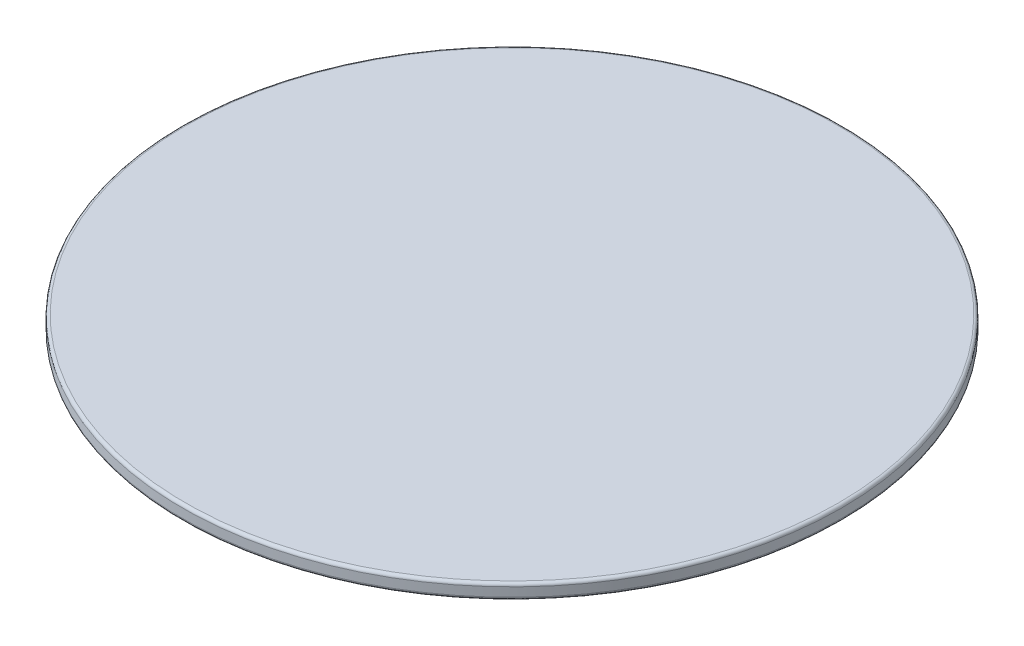
ISO-10303-21;
HEADER;
FILE_DESCRIPTION(('STEP AP214'),'2;1');
FILE_NAME('part.step','',(''),(''),'','','');
FILE_SCHEMA(('AUTOMOTIVE_DESIGN { 1 0 10303 214 1 1 1 1 }'));
ENDSEC;
DATA;
#1=APPLICATION_CONTEXT('core data for automotive mechanical design processes');
#2=APPLICATION_PROTOCOL_DEFINITION('international standard','automotive_design',2000,#1);
#3=PRODUCT_CONTEXT('',#1,'mechanical');
#4=PRODUCT('Part','Part','',(#3));
#5=PRODUCT_RELATED_PRODUCT_CATEGORY('part','',(#4));
#6=PRODUCT_DEFINITION_FORMATION('','',#4);
#7=PRODUCT_DEFINITION_CONTEXT('part definition',#1,'design');
#8=PRODUCT_DEFINITION('design','',#6,#7);
#9=PRODUCT_DEFINITION_SHAPE('','',#8);
#10=(LENGTH_UNIT() NAMED_UNIT(*) SI_UNIT(.MILLI.,.METRE.));
#11=(NAMED_UNIT(*) PLANE_ANGLE_UNIT() SI_UNIT($,.RADIAN.));
#12=(NAMED_UNIT(*) SI_UNIT($,.STERADIAN.) SOLID_ANGLE_UNIT());
#13=UNCERTAINTY_MEASURE_WITH_UNIT(LENGTH_MEASURE(1.E-05),#10,'distance_accuracy_value','');
#14=(GEOMETRIC_REPRESENTATION_CONTEXT(3) GLOBAL_UNCERTAINTY_ASSIGNED_CONTEXT((#13)) GLOBAL_UNIT_ASSIGNED_CONTEXT((#10,
#11,#12)) REPRESENTATION_CONTEXT('',''));
#15=CARTESIAN_POINT('',(0.,0.,0.));
#16=DIRECTION('',(0.,0.,1.));
#17=DIRECTION('',(1.,0.,0.));
#18=AXIS2_PLACEMENT_3D('',#15,#16,#17);
#19=CARTESIAN_POINT('',(225.,75.,-225.));
#20=DIRECTION('',(0.,-1.,0.));
#21=DIRECTION('',(1.,0.,0.));
#22=AXIS2_PLACEMENT_3D('',#19,#20,#21);
#23=CYLINDRICAL_SURFACE('',#22,220.);
#24=CARTESIAN_POINT('',(225.,67.,-225.));
#25=DIRECTION('',(0.,1.,0.));
#26=DIRECTION('',(-1.,0.,0.));
#27=AXIS2_PLACEMENT_3D('',#24,#25,#26);
#28=CIRCLE('',#27,220.);
#29=CARTESIAN_POINT('',(4.99999999999998,67.,-225.));
#30=VERTEX_POINT('',#29);
#31=EDGE_CURVE('E47',#30,#30,#28,.T.);
#32=ORIENTED_EDGE('',*,*,#31,.T.);
#33=EDGE_LOOP('',(#32));
#34=FACE_BOUND('',#33,.T.);
#35=CARTESIAN_POINT('',(225.,73.,-225.));
#36=DIRECTION('',(0.,1.,0.));
#37=DIRECTION('',(-1.,0.,0.));
#38=AXIS2_PLACEMENT_3D('',#35,#36,#37);
#39=CIRCLE('',#38,220.);
#40=CARTESIAN_POINT('',(4.99999999999998,73.,-225.));
#41=VERTEX_POINT('',#40);
#42=EDGE_CURVE('E51',#41,#41,#39,.F.);
#43=ORIENTED_EDGE('',*,*,#42,.T.);
#44=EDGE_LOOP('',(#43));
#45=FACE_BOUND('',#44,.T.);
#46=ADVANCED_FACE('F36',(#34,#45),#23,.T.);
#47=CARTESIAN_POINT('',(225.,75.,-225.));
#48=DIRECTION('',(0.,1.,0.));
#49=DIRECTION('',(-1.,0.,0.));
#50=AXIS2_PLACEMENT_3D('',#47,#48,#49);
#51=PLANE('',#50);
#52=CARTESIAN_POINT('',(225.,75.,-225.));
#53=DIRECTION('',(0.,1.,0.));
#54=DIRECTION('',(-1.,0.,0.));
#55=AXIS2_PLACEMENT_3D('',#52,#53,#54);
#56=CIRCLE('',#55,218.);
#57=CARTESIAN_POINT('',(6.99999999999998,75.,-225.));
#58=VERTEX_POINT('',#57);
#59=EDGE_CURVE('E10',#58,#58,#56,.T.);
#60=ORIENTED_EDGE('',*,*,#59,.T.);
#61=EDGE_LOOP('',(#60));
#62=FACE_BOUND('',#61,.T.);
#63=ADVANCED_FACE('F67',(#62),#51,.T.);
#64=CARTESIAN_POINT('',(225.,65.,-225.));
#65=DIRECTION('',(0.,1.,0.));
#66=DIRECTION('',(-1.,0.,0.));
#67=AXIS2_PLACEMENT_3D('',#64,#65,#66);
#68=PLANE('',#67);
#69=CARTESIAN_POINT('',(225.,65.,-225.));
#70=DIRECTION('',(0.,1.,0.));
#71=DIRECTION('',(-1.,0.,0.));
#72=AXIS2_PLACEMENT_3D('',#69,#70,#71);
#73=CIRCLE('',#72,218.);
#74=CARTESIAN_POINT('',(6.99999999999998,65.,-225.));
#75=VERTEX_POINT('',#74);
#76=EDGE_CURVE('E43',#75,#75,#73,.F.);
#77=ORIENTED_EDGE('',*,*,#76,.T.);
#78=EDGE_LOOP('',(#77));
#79=FACE_BOUND('',#78,.T.);
#80=ADVANCED_FACE('F64',(#79),#68,.F.);
#81=CARTESIAN_POINT('',(225.,67.,-225.));
#82=DIRECTION('',(0.,1.,0.));
#83=DIRECTION('',(-1.,0.,0.));
#84=AXIS2_PLACEMENT_3D('',#81,#82,#83);
#85=TOROIDAL_SURFACE('',#84,218.,2.);
#86=ORIENTED_EDGE('',*,*,#76,.F.);
#87=EDGE_LOOP('',(#86));
#88=FACE_BOUND('',#87,.T.);
#89=ORIENTED_EDGE('',*,*,#31,.F.);
#90=EDGE_LOOP('',(#89));
#91=FACE_BOUND('',#90,.T.);
#92=ADVANCED_FACE('F60',(#88,#91),#85,.T.);
#93=CARTESIAN_POINT('',(225.,73.,-225.));
#94=DIRECTION('',(0.,1.,0.));
#95=DIRECTION('',(-1.,0.,0.));
#96=AXIS2_PLACEMENT_3D('',#93,#94,#95);
#97=TOROIDAL_SURFACE('',#96,218.,2.);
#98=ORIENTED_EDGE('',*,*,#42,.F.);
#99=EDGE_LOOP('',(#98));
#100=FACE_BOUND('',#99,.T.);
#101=ORIENTED_EDGE('',*,*,#59,.F.);
#102=EDGE_LOOP('',(#101));
#103=FACE_BOUND('',#102,.T.);
#104=ADVANCED_FACE('F38',(#100,#103),#97,.T.);
#105=CLOSED_SHELL('',(#46,#63,#80,#92,#104));
#106=MANIFOLD_SOLID_BREP('B2',#105);
#107=ADVANCED_BREP_SHAPE_REPRESENTATION('',(#18,#106),#14);
#108=SHAPE_DEFINITION_REPRESENTATION(#9,#107);
ENDSEC;
END-ISO-10303-21;
